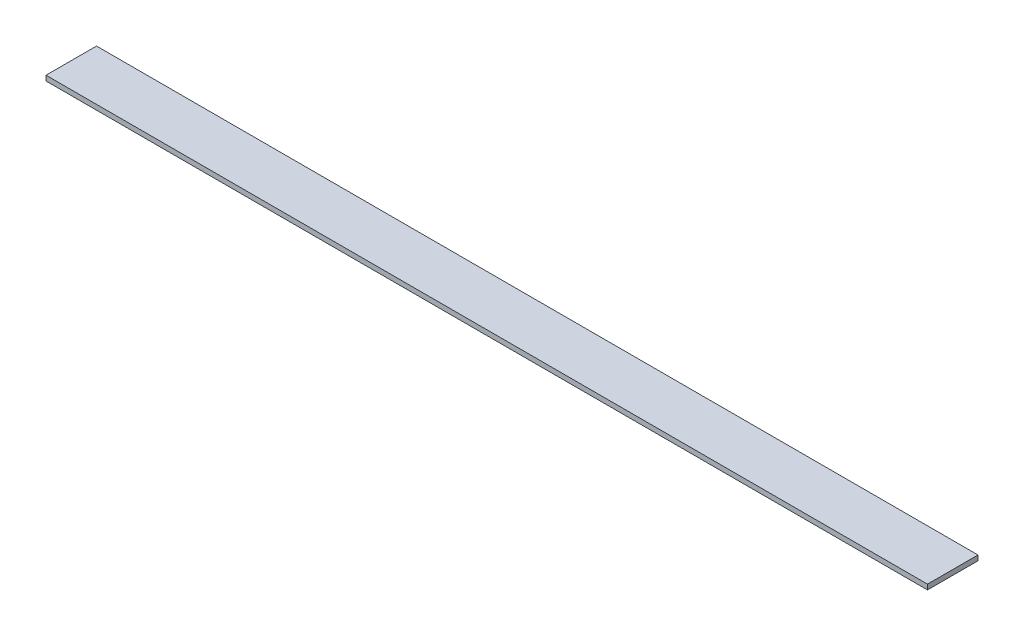
ISO-10303-21;
HEADER;
FILE_DESCRIPTION(('STEP AP214'),'2;1');
FILE_NAME('part.step','',(''),(''),'','','');
FILE_SCHEMA(('AUTOMOTIVE_DESIGN { 1 0 10303 214 1 1 1 1 }'));
ENDSEC;
DATA;
#1=APPLICATION_CONTEXT('core data for automotive mechanical design processes');
#2=APPLICATION_PROTOCOL_DEFINITION('international standard','automotive_design',2000,#1);
#3=PRODUCT_CONTEXT('',#1,'mechanical');
#4=PRODUCT('Part','Part','',(#3));
#5=PRODUCT_RELATED_PRODUCT_CATEGORY('part','',(#4));
#6=PRODUCT_DEFINITION_FORMATION('','',#4);
#7=PRODUCT_DEFINITION_CONTEXT('part definition',#1,'design');
#8=PRODUCT_DEFINITION('design','',#6,#7);
#9=PRODUCT_DEFINITION_SHAPE('','',#8);
#10=(LENGTH_UNIT() NAMED_UNIT(*) SI_UNIT(.MILLI.,.METRE.));
#11=(NAMED_UNIT(*) PLANE_ANGLE_UNIT() SI_UNIT($,.RADIAN.));
#12=(NAMED_UNIT(*) SI_UNIT($,.STERADIAN.) SOLID_ANGLE_UNIT());
#13=UNCERTAINTY_MEASURE_WITH_UNIT(LENGTH_MEASURE(1.E-05),#10,'distance_accuracy_value','');
#14=(GEOMETRIC_REPRESENTATION_CONTEXT(3) GLOBAL_UNCERTAINTY_ASSIGNED_CONTEXT((#13)) GLOBAL_UNIT_ASSIGNED_CONTEXT((#10,
#11,#12)) REPRESENTATION_CONTEXT('',''));
#15=CARTESIAN_POINT('',(0.,0.,0.));
#16=DIRECTION('',(0.,0.,1.));
#17=DIRECTION('',(1.,0.,0.));
#18=AXIS2_PLACEMENT_3D('',#15,#16,#17);
#19=CARTESIAN_POINT('',(443.23,0.,0.));
#20=DIRECTION('',(0.,0.,1.));
#21=DIRECTION('',(-1.,0.,0.));
#22=AXIS2_PLACEMENT_3D('',#19,#20,#21);
#23=PLANE('',#22);
#24=DIRECTION('',(0.,-1.,0.));
#25=VECTOR('',#24,1.);
#26=CARTESIAN_POINT('',(0.,0.,0.));
#27=LINE('',#26,#25);
#28=CARTESIAN_POINT('',(0.,2.54,0.));
#29=VERTEX_POINT('',#28);
#30=CARTESIAN_POINT('',(0.,0.,0.));
#31=VERTEX_POINT('',#30);
#32=EDGE_CURVE('E98',#29,#31,#27,.T.);
#33=ORIENTED_EDGE('',*,*,#32,.F.);
#34=DIRECTION('',(-1.,0.,0.));
#35=VECTOR('',#34,1.);
#36=CARTESIAN_POINT('',(443.23,2.54,0.));
#37=LINE('',#36,#35);
#38=CARTESIAN_POINT('',(443.23,2.54,0.));
#39=VERTEX_POINT('',#38);
#40=EDGE_CURVE('E97',#39,#29,#37,.T.);
#41=ORIENTED_EDGE('',*,*,#40,.F.);
#42=DIRECTION('',(0.,-1.,0.));
#43=VECTOR('',#42,1.);
#44=CARTESIAN_POINT('',(443.23,0.,0.));
#45=LINE('',#44,#43);
#46=CARTESIAN_POINT('',(443.23,0.,0.));
#47=VERTEX_POINT('',#46);
#48=EDGE_CURVE('E92',#39,#47,#45,.T.);
#49=ORIENTED_EDGE('',*,*,#48,.T.);
#50=DIRECTION('',(-1.,0.,0.));
#51=VECTOR('',#50,1.);
#52=CARTESIAN_POINT('',(443.23,0.,0.));
#53=LINE('',#52,#51);
#54=EDGE_CURVE('E11',#47,#31,#53,.T.);
#55=ORIENTED_EDGE('',*,*,#54,.T.);
#56=EDGE_LOOP('',(#33,#41,#49,#55));
#57=FACE_BOUND('',#56,.T.);
#58=ADVANCED_FACE('F35',(#57),#23,.F.);
#59=CARTESIAN_POINT('',(443.23,0.,0.));
#60=DIRECTION('',(0.,1.,0.));
#61=DIRECTION('',(0.,0.,-1.));
#62=AXIS2_PLACEMENT_3D('',#59,#60,#61);
#63=PLANE('',#62);
#64=DIRECTION('',(0.,0.,1.));
#65=VECTOR('',#64,1.);
#66=CARTESIAN_POINT('',(0.,0.,0.));
#67=LINE('',#66,#65);
#68=CARTESIAN_POINT('',(0.,0.,25.4));
#69=VERTEX_POINT('',#68);
#70=EDGE_CURVE('E100',#31,#69,#67,.T.);
#71=ORIENTED_EDGE('',*,*,#70,.F.);
#72=ORIENTED_EDGE('',*,*,#54,.F.);
#73=DIRECTION('',(0.,0.,1.));
#74=VECTOR('',#73,1.);
#75=CARTESIAN_POINT('',(443.23,0.,0.));
#76=LINE('',#75,#74);
#77=CARTESIAN_POINT('',(443.23,0.,25.4));
#78=VERTEX_POINT('',#77);
#79=EDGE_CURVE('E76',#47,#78,#76,.T.);
#80=ORIENTED_EDGE('',*,*,#79,.T.);
#81=DIRECTION('',(-1.,0.,0.));
#82=VECTOR('',#81,1.);
#83=CARTESIAN_POINT('',(443.23,0.,25.4));
#84=LINE('',#83,#82);
#85=EDGE_CURVE('E43',#78,#69,#84,.T.);
#86=ORIENTED_EDGE('',*,*,#85,.T.);
#87=EDGE_LOOP('',(#71,#72,#80,#86));
#88=FACE_BOUND('',#87,.T.);
#89=ADVANCED_FACE('F90',(#88),#63,.F.);
#90=CARTESIAN_POINT('',(443.23,0.,25.4));
#91=DIRECTION('',(0.,0.,-1.));
#92=DIRECTION('',(1.,0.,0.));
#93=AXIS2_PLACEMENT_3D('',#90,#91,#92);
#94=PLANE('',#93);
#95=DIRECTION('',(0.,1.,0.));
#96=VECTOR('',#95,1.);
#97=CARTESIAN_POINT('',(0.,0.,25.4));
#98=LINE('',#97,#96);
#99=CARTESIAN_POINT('',(0.,2.54,25.4));
#100=VERTEX_POINT('',#99);
#101=EDGE_CURVE('E86',#69,#100,#98,.T.);
#102=ORIENTED_EDGE('',*,*,#101,.F.);
#103=ORIENTED_EDGE('',*,*,#85,.F.);
#104=DIRECTION('',(0.,1.,0.));
#105=VECTOR('',#104,1.);
#106=CARTESIAN_POINT('',(443.23,0.,25.4));
#107=LINE('',#106,#105);
#108=CARTESIAN_POINT('',(443.23,2.54,25.4));
#109=VERTEX_POINT('',#108);
#110=EDGE_CURVE('E79',#78,#109,#107,.T.);
#111=ORIENTED_EDGE('',*,*,#110,.T.);
#112=DIRECTION('',(-1.,0.,0.));
#113=VECTOR('',#112,1.);
#114=CARTESIAN_POINT('',(443.23,2.54,25.4));
#115=LINE('',#114,#113);
#116=EDGE_CURVE('E89',#109,#100,#115,.T.);
#117=ORIENTED_EDGE('',*,*,#116,.T.);
#118=EDGE_LOOP('',(#102,#103,#111,#117));
#119=FACE_BOUND('',#118,.T.);
#120=ADVANCED_FACE('F85',(#119),#94,.F.);
#121=CARTESIAN_POINT('',(443.23,2.54,0.));
#122=DIRECTION('',(0.,-1.,0.));
#123=DIRECTION('',(0.,0.,1.));
#124=AXIS2_PLACEMENT_3D('',#121,#122,#123);
#125=PLANE('',#124);
#126=DIRECTION('',(0.,0.,-1.));
#127=VECTOR('',#126,1.);
#128=CARTESIAN_POINT('',(0.,2.54,0.));
#129=LINE('',#128,#127);
#130=EDGE_CURVE('E65',#100,#29,#129,.T.);
#131=ORIENTED_EDGE('',*,*,#130,.F.);
#132=ORIENTED_EDGE('',*,*,#116,.F.);
#133=DIRECTION('',(0.,0.,-1.));
#134=VECTOR('',#133,1.);
#135=CARTESIAN_POINT('',(443.23,2.54,0.));
#136=LINE('',#135,#134);
#137=EDGE_CURVE('E51',#109,#39,#136,.T.);
#138=ORIENTED_EDGE('',*,*,#137,.T.);
#139=ORIENTED_EDGE('',*,*,#40,.T.);
#140=EDGE_LOOP('',(#131,#132,#138,#139));
#141=FACE_BOUND('',#140,.T.);
#142=ADVANCED_FACE('F109',(#141),#125,.F.);
#143=CARTESIAN_POINT('',(443.23,0.,0.));
#144=DIRECTION('',(-1.,0.,0.));
#145=DIRECTION('',(0.,0.,-1.));
#146=AXIS2_PLACEMENT_3D('',#143,#144,#145);
#147=PLANE('',#146);
#148=ORIENTED_EDGE('',*,*,#48,.F.);
#149=ORIENTED_EDGE('',*,*,#137,.F.);
#150=ORIENTED_EDGE('',*,*,#110,.F.);
#151=ORIENTED_EDGE('',*,*,#79,.F.);
#152=EDGE_LOOP('',(#148,#149,#150,#151));
#153=FACE_BOUND('',#152,.T.);
#154=ADVANCED_FACE('F81',(#153),#147,.F.);
#155=CARTESIAN_POINT('',(0.,0.,0.));
#156=DIRECTION('',(-1.,0.,0.));
#157=DIRECTION('',(0.,0.,-1.));
#158=AXIS2_PLACEMENT_3D('',#155,#156,#157);
#159=PLANE('',#158);
#160=ORIENTED_EDGE('',*,*,#32,.T.);
#161=ORIENTED_EDGE('',*,*,#70,.T.);
#162=ORIENTED_EDGE('',*,*,#101,.T.);
#163=ORIENTED_EDGE('',*,*,#130,.T.);
#164=EDGE_LOOP('',(#160,#161,#162,#163));
#165=FACE_BOUND('',#164,.T.);
#166=ADVANCED_FACE('F105',(#165),#159,.T.);
#167=CLOSED_SHELL('',(#58,#89,#120,#142,#154,#166));
#168=MANIFOLD_SOLID_BREP('B2',#167);
#169=ADVANCED_BREP_SHAPE_REPRESENTATION('',(#18,#168),#14);
#170=SHAPE_DEFINITION_REPRESENTATION(#9,#169);
ENDSEC;
END-ISO-10303-21;
